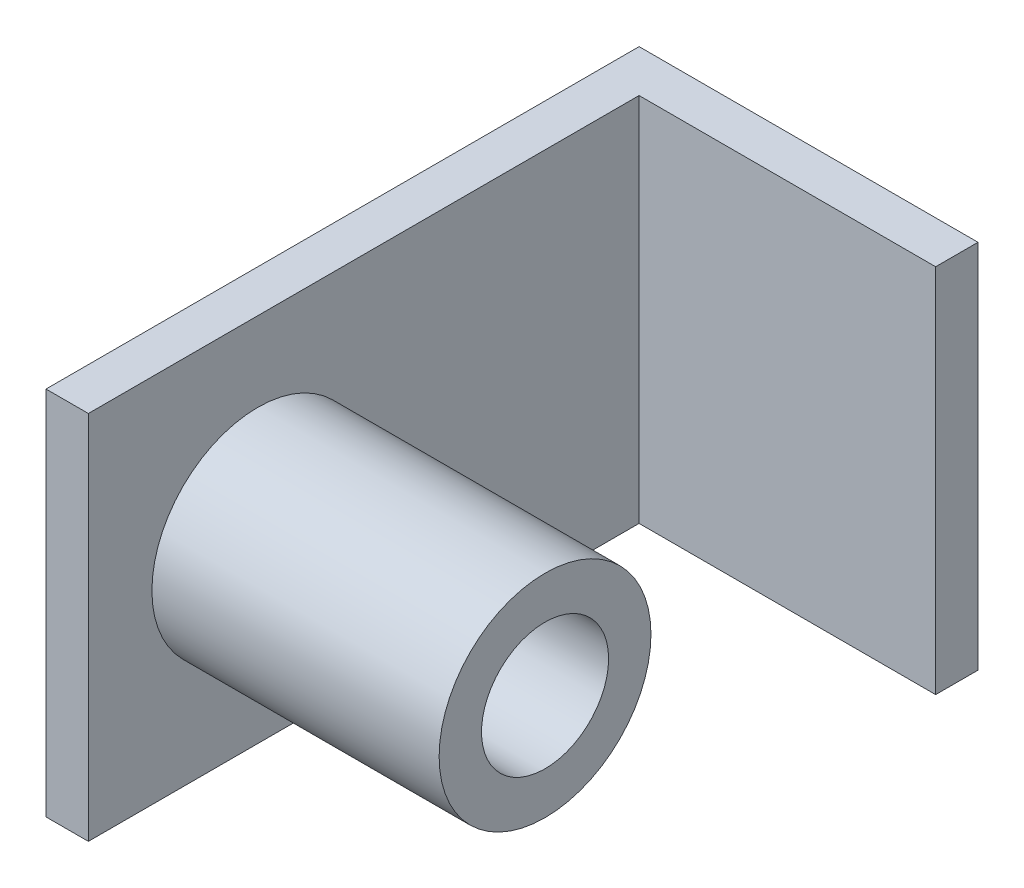
ISO-10303-21;
HEADER;
FILE_DESCRIPTION(('STEP AP214'),'2;1');
FILE_NAME('part.step','',(''),(''),'','','');
FILE_SCHEMA(('AUTOMOTIVE_DESIGN { 1 0 10303 214 1 1 1 1 }'));
ENDSEC;
DATA;
#1=APPLICATION_CONTEXT('core data for automotive mechanical design processes');
#2=APPLICATION_PROTOCOL_DEFINITION('international standard','automotive_design',2000,#1);
#3=PRODUCT_CONTEXT('',#1,'mechanical');
#4=PRODUCT('Part','Part','',(#3));
#5=PRODUCT_RELATED_PRODUCT_CATEGORY('part','',(#4));
#6=PRODUCT_DEFINITION_FORMATION('','',#4);
#7=PRODUCT_DEFINITION_CONTEXT('part definition',#1,'design');
#8=PRODUCT_DEFINITION('design','',#6,#7);
#9=PRODUCT_DEFINITION_SHAPE('','',#8);
#10=(LENGTH_UNIT() NAMED_UNIT(*) SI_UNIT(.MILLI.,.METRE.));
#11=(NAMED_UNIT(*) PLANE_ANGLE_UNIT() SI_UNIT($,.RADIAN.));
#12=(NAMED_UNIT(*) SI_UNIT($,.STERADIAN.) SOLID_ANGLE_UNIT());
#13=UNCERTAINTY_MEASURE_WITH_UNIT(LENGTH_MEASURE(1.E-05),#10,'distance_accuracy_value','');
#14=(GEOMETRIC_REPRESENTATION_CONTEXT(3) GLOBAL_UNCERTAINTY_ASSIGNED_CONTEXT((#13)) GLOBAL_UNIT_ASSIGNED_CONTEXT((#10,
#11,#12)) REPRESENTATION_CONTEXT('',''));
#15=CARTESIAN_POINT('',(0.,0.,0.));
#16=DIRECTION('',(0.,0.,1.));
#17=DIRECTION('',(1.,0.,0.));
#18=AXIS2_PLACEMENT_3D('',#15,#16,#17);
#19=CARTESIAN_POINT('',(101.6,111.092,12.7));
#20=DIRECTION('',(-1.,0.,0.));
#21=DIRECTION('',(0.,0.,1.));
#22=AXIS2_PLACEMENT_3D('',#19,#20,#21);
#23=PLANE('',#22);
#24=DIRECTION('',(0.,0.,-1.));
#25=VECTOR('',#24,1.);
#26=CARTESIAN_POINT('',(101.6,0.,12.7));
#27=LINE('',#26,#25);
#28=CARTESIAN_POINT('',(101.6,0.,12.7));
#29=VERTEX_POINT('',#28);
#30=CARTESIAN_POINT('',(101.6,0.,0.));
#31=VERTEX_POINT('',#30);
#32=EDGE_CURVE('E135',#29,#31,#27,.T.);
#33=ORIENTED_EDGE('',*,*,#32,.T.);
#34=DIRECTION('',(0.,-1.,0.));
#35=VECTOR('',#34,1.);
#36=CARTESIAN_POINT('',(101.6,111.092,0.));
#37=LINE('',#36,#35);
#38=CARTESIAN_POINT('',(101.6,111.092,0.));
#39=VERTEX_POINT('',#38);
#40=EDGE_CURVE('E162',#39,#31,#37,.T.);
#41=ORIENTED_EDGE('',*,*,#40,.F.);
#42=DIRECTION('',(0.,0.,-1.));
#43=VECTOR('',#42,1.);
#44=CARTESIAN_POINT('',(101.6,111.092,12.7));
#45=LINE('',#44,#43);
#46=CARTESIAN_POINT('',(101.6,111.092,12.7));
#47=VERTEX_POINT('',#46);
#48=EDGE_CURVE('E152',#47,#39,#45,.T.);
#49=ORIENTED_EDGE('',*,*,#48,.F.);
#50=DIRECTION('',(0.,-1.,0.));
#51=VECTOR('',#50,1.);
#52=CARTESIAN_POINT('',(101.6,111.092,12.7));
#53=LINE('',#52,#51);
#54=EDGE_CURVE('E131',#47,#29,#53,.T.);
#55=ORIENTED_EDGE('',*,*,#54,.T.);
#56=EDGE_LOOP('',(#33,#41,#49,#55));
#57=FACE_BOUND('',#56,.T.);
#58=ADVANCED_FACE('F45',(#57),#23,.F.);
#59=CARTESIAN_POINT('',(101.6,111.092,0.));
#60=DIRECTION('',(0.,0.,1.));
#61=DIRECTION('',(1.,0.,0.));
#62=AXIS2_PLACEMENT_3D('',#59,#60,#61);
#63=PLANE('',#62);
#64=CARTESIAN_POINT('',(50.8,55.546,0.));
#65=DIRECTION('',(0.,0.,-1.));
#66=DIRECTION('',(-1.,0.,0.));
#67=AXIS2_PLACEMENT_3D('',#64,#65,#66);
#68=CIRCLE('',#67,12.7);
#69=CARTESIAN_POINT('',(38.1,55.546,0.));
#70=VERTEX_POINT('',#69);
#71=EDGE_CURVE('E54',#70,#70,#68,.T.);
#72=ORIENTED_EDGE('',*,*,#71,.F.);
#73=EDGE_LOOP('',(#72));
#74=FACE_BOUND('',#73,.T.);
#75=DIRECTION('',(-1.,0.,0.));
#76=VECTOR('',#75,1.);
#77=CARTESIAN_POINT('',(101.6,0.,0.));
#78=LINE('',#77,#76);
#79=CARTESIAN_POINT('',(0.,0.,0.));
#80=VERTEX_POINT('',#79);
#81=EDGE_CURVE('E139',#31,#80,#78,.T.);
#82=ORIENTED_EDGE('',*,*,#81,.T.);
#83=DIRECTION('',(0.,-1.,0.));
#84=VECTOR('',#83,1.);
#85=CARTESIAN_POINT('',(0.,111.092,0.));
#86=LINE('',#85,#84);
#87=CARTESIAN_POINT('',(0.,111.092,0.));
#88=VERTEX_POINT('',#87);
#89=EDGE_CURVE('E159',#88,#80,#86,.T.);
#90=ORIENTED_EDGE('',*,*,#89,.F.);
#91=DIRECTION('',(-1.,0.,0.));
#92=VECTOR('',#91,1.);
#93=CARTESIAN_POINT('',(101.6,111.092,0.));
#94=LINE('',#93,#92);
#95=EDGE_CURVE('E100',#39,#88,#94,.T.);
#96=ORIENTED_EDGE('',*,*,#95,.F.);
#97=ORIENTED_EDGE('',*,*,#40,.T.);
#98=EDGE_LOOP('',(#82,#90,#96,#97));
#99=FACE_BOUND('',#98,.T.);
#100=ADVANCED_FACE('F209',(#74,#99),#63,.F.);
#101=CARTESIAN_POINT('',(0.,111.092,0.));
#102=DIRECTION('',(1.,0.,0.));
#103=DIRECTION('',(0.,0.,-1.));
#104=AXIS2_PLACEMENT_3D('',#101,#102,#103);
#105=PLANE('',#104);
#106=DIRECTION('',(0.,0.,1.));
#107=VECTOR('',#106,1.);
#108=CARTESIAN_POINT('',(0.,0.,0.));
#109=LINE('',#108,#107);
#110=CARTESIAN_POINT('',(0.,0.,177.8));
#111=VERTEX_POINT('',#110);
#112=EDGE_CURVE('E143',#80,#111,#109,.T.);
#113=ORIENTED_EDGE('',*,*,#112,.T.);
#114=DIRECTION('',(0.,-1.,0.));
#115=VECTOR('',#114,1.);
#116=CARTESIAN_POINT('',(0.,111.092,177.8));
#117=LINE('',#116,#115);
#118=CARTESIAN_POINT('',(0.,111.092,177.8));
#119=VERTEX_POINT('',#118);
#120=EDGE_CURVE('E124',#119,#111,#117,.T.);
#121=ORIENTED_EDGE('',*,*,#120,.F.);
#122=DIRECTION('',(0.,0.,1.));
#123=VECTOR('',#122,1.);
#124=CARTESIAN_POINT('',(0.,111.092,0.));
#125=LINE('',#124,#123);
#126=EDGE_CURVE('E113',#88,#119,#125,.T.);
#127=ORIENTED_EDGE('',*,*,#126,.F.);
#128=ORIENTED_EDGE('',*,*,#89,.T.);
#129=EDGE_LOOP('',(#113,#121,#127,#128));
#130=FACE_BOUND('',#129,.T.);
#131=ADVANCED_FACE('F215',(#130),#105,.F.);
#132=CARTESIAN_POINT('',(0.,111.092,177.8));
#133=DIRECTION('',(0.,0.,-1.));
#134=DIRECTION('',(-1.,0.,0.));
#135=AXIS2_PLACEMENT_3D('',#132,#133,#134);
#136=PLANE('',#135);
#137=DIRECTION('',(1.,0.,0.));
#138=VECTOR('',#137,1.);
#139=CARTESIAN_POINT('',(0.,0.,177.8));
#140=LINE('',#139,#138);
#141=CARTESIAN_POINT('',(12.7,0.,177.8));
#142=VERTEX_POINT('',#141);
#143=EDGE_CURVE('E122',#111,#142,#140,.T.);
#144=ORIENTED_EDGE('',*,*,#143,.T.);
#145=DIRECTION('',(0.,-1.,0.));
#146=VECTOR('',#145,1.);
#147=CARTESIAN_POINT('',(12.7,111.092,177.8));
#148=LINE('',#147,#146);
#149=CARTESIAN_POINT('',(12.7,111.092,177.8));
#150=VERTEX_POINT('',#149);
#151=EDGE_CURVE('E119',#150,#142,#148,.T.);
#152=ORIENTED_EDGE('',*,*,#151,.F.);
#153=DIRECTION('',(1.,0.,0.));
#154=VECTOR('',#153,1.);
#155=CARTESIAN_POINT('',(0.,111.092,177.8));
#156=LINE('',#155,#154);
#157=EDGE_CURVE('E107',#119,#150,#156,.T.);
#158=ORIENTED_EDGE('',*,*,#157,.F.);
#159=ORIENTED_EDGE('',*,*,#120,.T.);
#160=EDGE_LOOP('',(#144,#152,#158,#159));
#161=FACE_BOUND('',#160,.T.);
#162=ADVANCED_FACE('F120',(#161),#136,.F.);
#163=CARTESIAN_POINT('',(12.7,111.092,177.8));
#164=DIRECTION('',(-1.,0.,0.));
#165=DIRECTION('',(0.,0.,1.));
#166=AXIS2_PLACEMENT_3D('',#163,#164,#165);
#167=PLANE('',#166);
#168=CARTESIAN_POINT('',(12.7,55.546,127.));
#169=DIRECTION('',(-1.,0.,0.));
#170=DIRECTION('',(0.,0.,1.));
#171=AXIS2_PLACEMENT_3D('',#168,#169,#170);
#172=CIRCLE('',#171,31.75);
#173=CARTESIAN_POINT('',(12.7,55.546,158.75));
#174=VERTEX_POINT('',#173);
#175=EDGE_CURVE('E11',#174,#174,#172,.F.);
#176=ORIENTED_EDGE('',*,*,#175,.F.);
#177=EDGE_LOOP('',(#176));
#178=FACE_BOUND('',#177,.T.);
#179=DIRECTION('',(0.,0.,-1.));
#180=VECTOR('',#179,1.);
#181=CARTESIAN_POINT('',(12.7,0.,177.8));
#182=LINE('',#181,#180);
#183=CARTESIAN_POINT('',(12.7,0.,12.7));
#184=VERTEX_POINT('',#183);
#185=EDGE_CURVE('E85',#142,#184,#182,.T.);
#186=ORIENTED_EDGE('',*,*,#185,.T.);
#187=DIRECTION('',(0.,-1.,0.));
#188=VECTOR('',#187,1.);
#189=CARTESIAN_POINT('',(12.7,111.092,12.7));
#190=LINE('',#189,#188);
#191=CARTESIAN_POINT('',(12.7,111.092,12.7));
#192=VERTEX_POINT('',#191);
#193=EDGE_CURVE('E125',#192,#184,#190,.T.);
#194=ORIENTED_EDGE('',*,*,#193,.F.);
#195=DIRECTION('',(0.,0.,-1.));
#196=VECTOR('',#195,1.);
#197=CARTESIAN_POINT('',(12.7,111.092,177.8));
#198=LINE('',#197,#196);
#199=EDGE_CURVE('E111',#150,#192,#198,.T.);
#200=ORIENTED_EDGE('',*,*,#199,.F.);
#201=ORIENTED_EDGE('',*,*,#151,.T.);
#202=EDGE_LOOP('',(#186,#194,#200,#201));
#203=FACE_BOUND('',#202,.T.);
#204=ADVANCED_FACE('F127',(#178,#203),#167,.F.);
#205=CARTESIAN_POINT('',(12.7,111.092,12.7));
#206=DIRECTION('',(0.,0.,-1.));
#207=DIRECTION('',(-1.,0.,0.));
#208=AXIS2_PLACEMENT_3D('',#205,#206,#207);
#209=PLANE('',#208);
#210=DIRECTION('',(1.,0.,0.));
#211=VECTOR('',#210,1.);
#212=CARTESIAN_POINT('',(12.7,0.,12.7));
#213=LINE('',#212,#211);
#214=EDGE_CURVE('E91',#184,#29,#213,.T.);
#215=ORIENTED_EDGE('',*,*,#214,.T.);
#216=ORIENTED_EDGE('',*,*,#54,.F.);
#217=DIRECTION('',(1.,0.,0.));
#218=VECTOR('',#217,1.);
#219=CARTESIAN_POINT('',(12.7,111.092,12.7));
#220=LINE('',#219,#218);
#221=EDGE_CURVE('E62',#192,#47,#220,.T.);
#222=ORIENTED_EDGE('',*,*,#221,.F.);
#223=ORIENTED_EDGE('',*,*,#193,.T.);
#224=EDGE_LOOP('',(#215,#216,#222,#223));
#225=FACE_BOUND('',#224,.T.);
#226=ADVANCED_FACE('F230',(#225),#209,.F.);
#227=CARTESIAN_POINT('',(0.,111.092,0.));
#228=DIRECTION('',(0.,1.,0.));
#229=DIRECTION('',(0.,0.,1.));
#230=AXIS2_PLACEMENT_3D('',#227,#228,#229);
#231=PLANE('',#230);
#232=ORIENTED_EDGE('',*,*,#48,.T.);
#233=ORIENTED_EDGE('',*,*,#95,.T.);
#234=ORIENTED_EDGE('',*,*,#126,.T.);
#235=ORIENTED_EDGE('',*,*,#157,.T.);
#236=ORIENTED_EDGE('',*,*,#199,.T.);
#237=ORIENTED_EDGE('',*,*,#221,.T.);
#238=EDGE_LOOP('',(#232,#233,#234,#235,#236,#237));
#239=FACE_BOUND('',#238,.T.);
#240=ADVANCED_FACE('F109',(#239),#231,.T.);
#241=CARTESIAN_POINT('',(0.,0.,0.));
#242=DIRECTION('',(0.,1.,0.));
#243=DIRECTION('',(0.,0.,1.));
#244=AXIS2_PLACEMENT_3D('',#241,#242,#243);
#245=PLANE('',#244);
#246=ORIENTED_EDGE('',*,*,#32,.F.);
#247=ORIENTED_EDGE('',*,*,#214,.F.);
#248=ORIENTED_EDGE('',*,*,#185,.F.);
#249=ORIENTED_EDGE('',*,*,#143,.F.);
#250=ORIENTED_EDGE('',*,*,#112,.F.);
#251=ORIENTED_EDGE('',*,*,#81,.F.);
#252=EDGE_LOOP('',(#246,#247,#248,#249,#250,#251));
#253=FACE_BOUND('',#252,.T.);
#254=ADVANCED_FACE('F220',(#253),#245,.F.);
#255=CARTESIAN_POINT('',(50.8,55.546,-25.4));
#256=DIRECTION('',(0.,0.,1.));
#257=DIRECTION('',(1.,0.,0.));
#258=AXIS2_PLACEMENT_3D('',#255,#256,#257);
#259=CYLINDRICAL_SURFACE('',#258,12.7);
#260=CARTESIAN_POINT('',(50.8,55.546,-25.4));
#261=DIRECTION('',(0.,0.,-1.));
#262=DIRECTION('',(-1.,0.,0.));
#263=AXIS2_PLACEMENT_3D('',#260,#261,#262);
#264=CIRCLE('',#263,12.7);
#265=CARTESIAN_POINT('',(38.1,55.546,-25.4));
#266=VERTEX_POINT('',#265);
#267=EDGE_CURVE('E140',#266,#266,#264,.T.);
#268=ORIENTED_EDGE('',*,*,#267,.F.);
#269=EDGE_LOOP('',(#268));
#270=FACE_BOUND('',#269,.T.);
#271=ORIENTED_EDGE('',*,*,#71,.T.);
#272=EDGE_LOOP('',(#271));
#273=FACE_BOUND('',#272,.T.);
#274=ADVANCED_FACE('F236',(#270,#273),#259,.T.);
#275=CARTESIAN_POINT('',(50.8,55.546,-25.4));
#276=DIRECTION('',(0.,0.,-1.));
#277=DIRECTION('',(-1.,0.,0.));
#278=AXIS2_PLACEMENT_3D('',#275,#276,#277);
#279=PLANE('',#278);
#280=ORIENTED_EDGE('',*,*,#267,.T.);
#281=EDGE_LOOP('',(#280));
#282=FACE_BOUND('',#281,.T.);
#283=ADVANCED_FACE('F241',(#282),#279,.T.);
#284=CARTESIAN_POINT('',(98.806,55.546,127.));
#285=DIRECTION('',(1.,0.,0.));
#286=DIRECTION('',(0.,0.,-1.));
#287=AXIS2_PLACEMENT_3D('',#284,#285,#286);
#288=PLANE('',#287);
#289=CARTESIAN_POINT('',(98.806,55.546,127.));
#290=DIRECTION('',(1.,0.,0.));
#291=DIRECTION('',(0.,0.,-1.));
#292=AXIS2_PLACEMENT_3D('',#289,#290,#291);
#293=CIRCLE('',#292,31.75);
#294=CARTESIAN_POINT('',(98.806,55.546,95.25));
#295=VERTEX_POINT('',#294);
#296=EDGE_CURVE('E180',#295,#295,#293,.T.);
#297=ORIENTED_EDGE('',*,*,#296,.T.);
#298=EDGE_LOOP('',(#297));
#299=FACE_BOUND('',#298,.T.);
#300=CARTESIAN_POINT('',(98.806,55.546,127.));
#301=DIRECTION('',(1.,0.,0.));
#302=DIRECTION('',(0.,0.,-1.));
#303=AXIS2_PLACEMENT_3D('',#300,#301,#302);
#304=CIRCLE('',#303,19.05);
#305=CARTESIAN_POINT('',(98.806,55.546,107.95));
#306=VERTEX_POINT('',#305);
#307=EDGE_CURVE('E183',#306,#306,#304,.T.);
#308=ORIENTED_EDGE('',*,*,#307,.F.);
#309=EDGE_LOOP('',(#308));
#310=FACE_BOUND('',#309,.T.);
#311=ADVANCED_FACE('F204',(#299,#310),#288,.T.);
#312=CARTESIAN_POINT('',(98.806,55.546,127.));
#313=DIRECTION('',(-1.,0.,0.));
#314=DIRECTION('',(0.,0.,1.));
#315=AXIS2_PLACEMENT_3D('',#312,#313,#314);
#316=CYLINDRICAL_SURFACE('',#315,31.75);
#317=ORIENTED_EDGE('',*,*,#296,.F.);
#318=EDGE_LOOP('',(#317));
#319=FACE_BOUND('',#318,.T.);
#320=ORIENTED_EDGE('',*,*,#175,.T.);
#321=EDGE_LOOP('',(#320));
#322=FACE_BOUND('',#321,.T.);
#323=ADVANCED_FACE('F196',(#319,#322),#316,.T.);
#324=CARTESIAN_POINT('',(98.806,55.546,127.));
#325=DIRECTION('',(-1.,0.,0.));
#326=DIRECTION('',(0.,0.,1.));
#327=AXIS2_PLACEMENT_3D('',#324,#325,#326);
#328=CYLINDRICAL_SURFACE('',#327,19.05);
#329=ORIENTED_EDGE('',*,*,#307,.T.);
#330=EDGE_LOOP('',(#329));
#331=FACE_BOUND('',#330,.T.);
#332=CARTESIAN_POINT('',(12.7,55.546,127.));
#333=DIRECTION('',(1.,0.,0.));
#334=DIRECTION('',(0.,0.,-1.));
#335=AXIS2_PLACEMENT_3D('',#332,#333,#334);
#336=CIRCLE('',#335,19.05);
#337=CARTESIAN_POINT('',(12.7,55.546,107.95));
#338=VERTEX_POINT('',#337);
#339=EDGE_CURVE('E186',#338,#338,#336,.T.);
#340=ORIENTED_EDGE('',*,*,#339,.F.);
#341=EDGE_LOOP('',(#340));
#342=FACE_BOUND('',#341,.T.);
#343=ADVANCED_FACE('F194',(#331,#342),#328,.F.);
#344=ORIENTED_EDGE('',*,*,#339,.T.);
#345=EDGE_LOOP('',(#344));
#346=FACE_BOUND('',#345,.T.);
#347=ADVANCED_FACE('F192',(#346),#167,.F.);
#348=CLOSED_SHELL('',(#58,#100,#131,#162,#204,#226,#240,#254,#274,#283,#311,#323,#343,#347));
#349=MANIFOLD_SOLID_BREP('B2',#348);
#350=ADVANCED_BREP_SHAPE_REPRESENTATION('',(#18,#349),#14);
#351=SHAPE_DEFINITION_REPRESENTATION(#9,#350);
ENDSEC;
END-ISO-10303-21;
